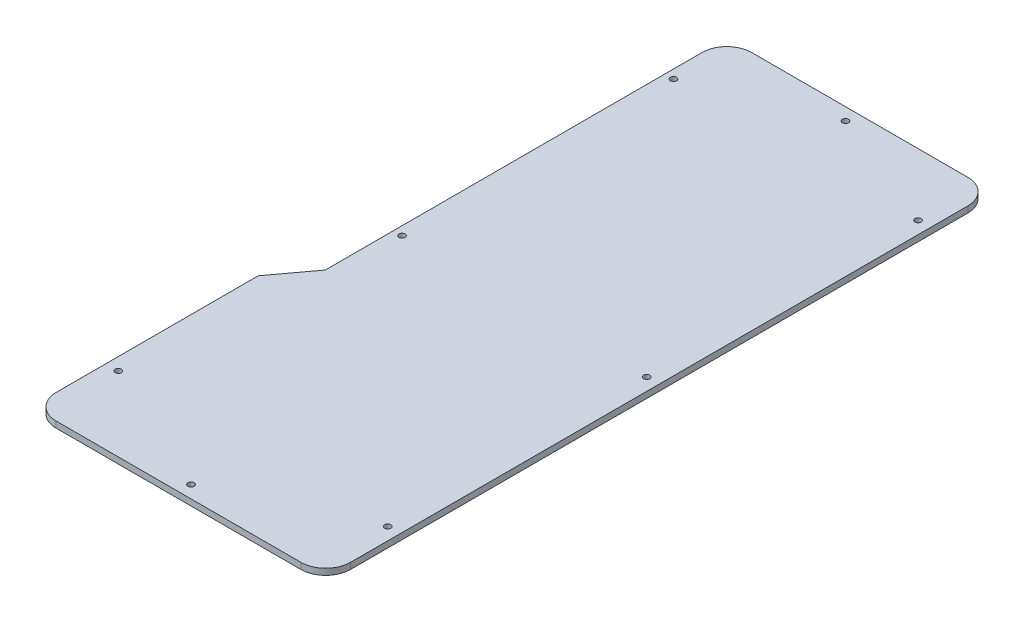
ISO-10303-21;
HEADER;
FILE_DESCRIPTION(('STEP AP214'),'2;1');
FILE_NAME('part.step','',(''),(''),'','','');
FILE_SCHEMA(('AUTOMOTIVE_DESIGN { 1 0 10303 214 1 1 1 1 }'));
ENDSEC;
DATA;
#1=APPLICATION_CONTEXT('core data for automotive mechanical design processes');
#2=APPLICATION_PROTOCOL_DEFINITION('international standard','automotive_design',2000,#1);
#3=PRODUCT_CONTEXT('',#1,'mechanical');
#4=PRODUCT('Part','Part','',(#3));
#5=PRODUCT_RELATED_PRODUCT_CATEGORY('part','',(#4));
#6=PRODUCT_DEFINITION_FORMATION('','',#4);
#7=PRODUCT_DEFINITION_CONTEXT('part definition',#1,'design');
#8=PRODUCT_DEFINITION('design','',#6,#7);
#9=PRODUCT_DEFINITION_SHAPE('','',#8);
#10=(LENGTH_UNIT() NAMED_UNIT(*) SI_UNIT(.MILLI.,.METRE.));
#11=(NAMED_UNIT(*) PLANE_ANGLE_UNIT() SI_UNIT($,.RADIAN.));
#12=(NAMED_UNIT(*) SI_UNIT($,.STERADIAN.) SOLID_ANGLE_UNIT());
#13=UNCERTAINTY_MEASURE_WITH_UNIT(LENGTH_MEASURE(1.E-05),#10,'distance_accuracy_value','');
#14=(GEOMETRIC_REPRESENTATION_CONTEXT(3) GLOBAL_UNCERTAINTY_ASSIGNED_CONTEXT((#13)) GLOBAL_UNIT_ASSIGNED_CONTEXT((#10,
#11,#12)) REPRESENTATION_CONTEXT('',''));
#15=CARTESIAN_POINT('',(0.,0.,0.));
#16=DIRECTION('',(0.,0.,1.));
#17=DIRECTION('',(1.,0.,0.));
#18=AXIS2_PLACEMENT_3D('',#15,#16,#17);
#19=CARTESIAN_POINT('',(51.,393.5,598.5));
#20=DIRECTION('',(0.,-1.,0.));
#21=DIRECTION('',(0.,0.,-1.));
#22=AXIS2_PLACEMENT_3D('',#19,#20,#21);
#23=PLANE('',#22);
#24=CARTESIAN_POINT('',(258.,393.5,350.));
#25=DIRECTION('',(0.,1.,0.));
#26=DIRECTION('',(0.,0.,-1.));
#27=AXIS2_PLACEMENT_3D('',#24,#25,#26);
#28=CIRCLE('',#27,2.50000000000002);
#29=CARTESIAN_POINT('',(258.,393.5,347.5));
#30=VERTEX_POINT('',#29);
#31=EDGE_CURVE('E294',#30,#30,#28,.T.);
#32=ORIENTED_EDGE('',*,*,#31,.T.);
#33=EDGE_LOOP('',(#32));
#34=FACE_BOUND('',#33,.T.);
#35=CARTESIAN_POINT('',(258.,393.5,558.5));
#36=DIRECTION('',(0.,1.,0.));
#37=DIRECTION('',(0.,0.,-1.));
#38=AXIS2_PLACEMENT_3D('',#35,#36,#37);
#39=CIRCLE('',#38,2.50000000000008);
#40=CARTESIAN_POINT('',(258.,393.5,556.));
#41=VERTEX_POINT('',#40);
#42=EDGE_CURVE('E302',#41,#41,#39,.T.);
#43=ORIENTED_EDGE('',*,*,#42,.T.);
#44=EDGE_LOOP('',(#43));
#45=FACE_BOUND('',#44,.T.);
#46=CARTESIAN_POINT('',(61.0000000000001,393.5,350.));
#47=DIRECTION('',(0.,1.,0.));
#48=DIRECTION('',(0.,0.,-1.));
#49=AXIS2_PLACEMENT_3D('',#46,#47,#48);
#50=CIRCLE('',#49,2.5);
#51=CARTESIAN_POINT('',(61.0000000000001,393.5,347.5));
#52=VERTEX_POINT('',#51);
#53=EDGE_CURVE('E310',#52,#52,#50,.T.);
#54=ORIENTED_EDGE('',*,*,#53,.T.);
#55=EDGE_LOOP('',(#54));
#56=FACE_BOUND('',#55,.T.);
#57=CARTESIAN_POINT('',(159.5,393.5,91.4999999999998));
#58=DIRECTION('',(0.,1.,0.));
#59=DIRECTION('',(0.,0.,-1.));
#60=AXIS2_PLACEMENT_3D('',#57,#58,#59);
#61=CIRCLE('',#60,2.5);
#62=CARTESIAN_POINT('',(159.5,393.5,88.9999999999998));
#63=VERTEX_POINT('',#62);
#64=EDGE_CURVE('E219',#63,#63,#61,.T.);
#65=ORIENTED_EDGE('',*,*,#64,.T.);
#66=EDGE_LOOP('',(#65));
#67=FACE_BOUND('',#66,.T.);
#68=DIRECTION('',(-0.595227550625737,0.,0.803557193344746));
#69=VECTOR('',#68,1.);
#70=CARTESIAN_POINT('',(51.0000000000001,393.5,408.899404767177));
#71=LINE('',#70,#69);
#72=CARTESIAN_POINT('',(54.0000000000001,393.5,404.849404767177));
#73=VERTEX_POINT('',#72);
#74=CARTESIAN_POINT('',(31.,393.5,435.899404767177));
#75=VERTEX_POINT('',#74);
#76=EDGE_CURVE('E153',#73,#75,#71,.T.);
#77=ORIENTED_EDGE('',*,*,#76,.F.);
#78=DIRECTION('',(0.,0.,1.));
#79=VECTOR('',#78,1.);
#80=CARTESIAN_POINT('',(54.0000000000001,393.5,101.5));
#81=LINE('',#80,#79);
#82=CARTESIAN_POINT('',(54.0000000000001,393.5,101.5));
#83=VERTEX_POINT('',#82);
#84=EDGE_CURVE('E211',#83,#73,#81,.T.);
#85=ORIENTED_EDGE('',*,*,#84,.F.);
#86=CARTESIAN_POINT('',(74.0000000000001,393.5,101.5));
#87=DIRECTION('',(0.,1.,0.));
#88=DIRECTION('',(0.,0.,-1.));
#89=AXIS2_PLACEMENT_3D('',#86,#87,#88);
#90=CIRCLE('',#89,20.);
#91=CARTESIAN_POINT('',(74.0000000000002,393.5,81.4999999999998));
#92=VERTEX_POINT('',#91);
#93=EDGE_CURVE('E175',#92,#83,#90,.T.);
#94=ORIENTED_EDGE('',*,*,#93,.F.);
#95=DIRECTION('',(-1.,0.,0.));
#96=VECTOR('',#95,1.);
#97=CARTESIAN_POINT('',(248.,393.5,81.4999999999998));
#98=LINE('',#97,#96);
#99=CARTESIAN_POINT('',(248.,393.5,81.4999999999998));
#100=VERTEX_POINT('',#99);
#101=EDGE_CURVE('E172',#100,#92,#98,.T.);
#102=ORIENTED_EDGE('',*,*,#101,.F.);
#103=CARTESIAN_POINT('',(248.,393.5,101.5));
#104=DIRECTION('',(0.,1.,0.));
#105=DIRECTION('',(0.,0.,-1.));
#106=AXIS2_PLACEMENT_3D('',#103,#104,#105);
#107=CIRCLE('',#106,20.);
#108=CARTESIAN_POINT('',(268.,393.5,101.5));
#109=VERTEX_POINT('',#108);
#110=EDGE_CURVE('E169',#109,#100,#107,.T.);
#111=ORIENTED_EDGE('',*,*,#110,.F.);
#112=DIRECTION('',(0.,0.,-1.));
#113=VECTOR('',#112,1.);
#114=CARTESIAN_POINT('',(268.,393.5,598.5));
#115=LINE('',#114,#113);
#116=CARTESIAN_POINT('',(268.,393.5,598.5));
#117=VERTEX_POINT('',#116);
#118=EDGE_CURVE('E166',#117,#109,#115,.T.);
#119=ORIENTED_EDGE('',*,*,#118,.F.);
#120=CARTESIAN_POINT('',(248.,393.5,598.5));
#121=DIRECTION('',(0.,1.,0.));
#122=DIRECTION('',(0.,0.,-1.));
#123=AXIS2_PLACEMENT_3D('',#120,#121,#122);
#124=CIRCLE('',#123,20.);
#125=CARTESIAN_POINT('',(248.,393.5,618.5));
#126=VERTEX_POINT('',#125);
#127=EDGE_CURVE('E160',#126,#117,#124,.T.);
#128=ORIENTED_EDGE('',*,*,#127,.F.);
#129=DIRECTION('',(1.,0.,0.));
#130=VECTOR('',#129,1.);
#131=CARTESIAN_POINT('',(51.0000000000002,393.5,618.5));
#132=LINE('',#131,#130);
#133=CARTESIAN_POINT('',(51.0000000000002,393.5,618.5));
#134=VERTEX_POINT('',#133);
#135=EDGE_CURVE('E158',#134,#126,#132,.T.);
#136=ORIENTED_EDGE('',*,*,#135,.F.);
#137=CARTESIAN_POINT('',(51.,393.5,598.5));
#138=DIRECTION('',(0.,1.,0.));
#139=DIRECTION('',(0.,0.,-1.));
#140=AXIS2_PLACEMENT_3D('',#137,#138,#139);
#141=CIRCLE('',#140,20.);
#142=CARTESIAN_POINT('',(31.,393.5,598.5));
#143=VERTEX_POINT('',#142);
#144=EDGE_CURVE('E139',#143,#134,#141,.T.);
#145=ORIENTED_EDGE('',*,*,#144,.F.);
#146=DIRECTION('',(0.,0.,1.));
#147=VECTOR('',#146,1.);
#148=CARTESIAN_POINT('',(31.,393.5,421.899404767177));
#149=LINE('',#148,#147);
#150=EDGE_CURVE('E149',#75,#143,#149,.T.);
#151=ORIENTED_EDGE('',*,*,#150,.F.);
#152=EDGE_LOOP('',(#77,#85,#94,#102,#111,#119,#128,#136,#145,#151));
#153=FACE_BOUND('',#152,.T.);
#154=CARTESIAN_POINT('',(61.0000000000001,393.5,131.5));
#155=DIRECTION('',(0.,1.,0.));
#156=DIRECTION('',(0.,0.,-1.));
#157=AXIS2_PLACEMENT_3D('',#154,#155,#156);
#158=CIRCLE('',#157,2.5);
#159=CARTESIAN_POINT('',(61.0000000000001,393.5,129.));
#160=VERTEX_POINT('',#159);
#161=EDGE_CURVE('E314',#160,#160,#158,.T.);
#162=ORIENTED_EDGE('',*,*,#161,.T.);
#163=EDGE_LOOP('',(#162));
#164=FACE_BOUND('',#163,.T.);
#165=CARTESIAN_POINT('',(41.,393.5,558.5));
#166=DIRECTION('',(0.,1.,0.));
#167=DIRECTION('',(0.,0.,-1.));
#168=AXIS2_PLACEMENT_3D('',#165,#166,#167);
#169=CIRCLE('',#168,2.50000000000006);
#170=CARTESIAN_POINT('',(41.,393.5,556.));
#171=VERTEX_POINT('',#170);
#172=EDGE_CURVE('E306',#171,#171,#169,.T.);
#173=ORIENTED_EDGE('',*,*,#172,.T.);
#174=EDGE_LOOP('',(#173));
#175=FACE_BOUND('',#174,.T.);
#176=CARTESIAN_POINT('',(258.,393.5,131.5));
#177=DIRECTION('',(0.,1.,0.));
#178=DIRECTION('',(0.,0.,-1.));
#179=AXIS2_PLACEMENT_3D('',#176,#177,#178);
#180=CIRCLE('',#179,2.50000000000002);
#181=CARTESIAN_POINT('',(258.,393.5,129.));
#182=VERTEX_POINT('',#181);
#183=EDGE_CURVE('E298',#182,#182,#180,.T.);
#184=ORIENTED_EDGE('',*,*,#183,.T.);
#185=EDGE_LOOP('',(#184));
#186=FACE_BOUND('',#185,.T.);
#187=CARTESIAN_POINT('',(149.5,393.5,608.5));
#188=DIRECTION('',(0.,1.,0.));
#189=DIRECTION('',(0.,0.,-1.));
#190=AXIS2_PLACEMENT_3D('',#187,#188,#189);
#191=CIRCLE('',#190,2.49999999999994);
#192=CARTESIAN_POINT('',(149.5,393.5,606.));
#193=VERTEX_POINT('',#192);
#194=EDGE_CURVE('E289',#193,#193,#191,.T.);
#195=ORIENTED_EDGE('',*,*,#194,.T.);
#196=EDGE_LOOP('',(#195));
#197=FACE_BOUND('',#196,.T.);
#198=ADVANCED_FACE('F46',(#34,#45,#56,#67,#153,#164,#175,#186,#197),#23,.T.);
#199=CARTESIAN_POINT('',(51.,398.5,598.5));
#200=DIRECTION('',(0.,-1.,0.));
#201=DIRECTION('',(0.,0.,-1.));
#202=AXIS2_PLACEMENT_3D('',#199,#200,#201);
#203=PLANE('',#202);
#204=DIRECTION('',(-0.595227550625737,0.,0.803557193344746));
#205=VECTOR('',#204,1.);
#206=CARTESIAN_POINT('',(51.0000000000001,398.5,408.899404767177));
#207=LINE('',#206,#205);
#208=CARTESIAN_POINT('',(54.0000000000001,398.5,404.849404767177));
#209=VERTEX_POINT('',#208);
#210=CARTESIAN_POINT('',(31.,398.5,435.899404767177));
#211=VERTEX_POINT('',#210);
#212=EDGE_CURVE('E178',#209,#211,#207,.T.);
#213=ORIENTED_EDGE('',*,*,#212,.T.);
#214=DIRECTION('',(0.,0.,1.));
#215=VECTOR('',#214,1.);
#216=CARTESIAN_POINT('',(31.,398.5,421.899404767177));
#217=LINE('',#216,#215);
#218=CARTESIAN_POINT('',(31.,398.5,598.5));
#219=VERTEX_POINT('',#218);
#220=EDGE_CURVE('E176',#211,#219,#217,.T.);
#221=ORIENTED_EDGE('',*,*,#220,.T.);
#222=CARTESIAN_POINT('',(51.,398.5,598.5));
#223=DIRECTION('',(0.,1.,0.));
#224=DIRECTION('',(0.,0.,-1.));
#225=AXIS2_PLACEMENT_3D('',#222,#223,#224);
#226=CIRCLE('',#225,20.);
#227=CARTESIAN_POINT('',(51.0000000000002,398.5,618.5));
#228=VERTEX_POINT('',#227);
#229=EDGE_CURVE('E142',#219,#228,#226,.T.);
#230=ORIENTED_EDGE('',*,*,#229,.T.);
#231=DIRECTION('',(1.,0.,0.));
#232=VECTOR('',#231,1.);
#233=CARTESIAN_POINT('',(51.0000000000002,398.5,618.5));
#234=LINE('',#233,#232);
#235=CARTESIAN_POINT('',(248.,398.5,618.5));
#236=VERTEX_POINT('',#235);
#237=EDGE_CURVE('E180',#228,#236,#234,.T.);
#238=ORIENTED_EDGE('',*,*,#237,.T.);
#239=CARTESIAN_POINT('',(248.,398.5,598.5));
#240=DIRECTION('',(0.,1.,0.));
#241=DIRECTION('',(0.,0.,-1.));
#242=AXIS2_PLACEMENT_3D('',#239,#240,#241);
#243=CIRCLE('',#242,20.);
#244=CARTESIAN_POINT('',(268.,398.5,598.5));
#245=VERTEX_POINT('',#244);
#246=EDGE_CURVE('E183',#236,#245,#243,.T.);
#247=ORIENTED_EDGE('',*,*,#246,.T.);
#248=DIRECTION('',(0.,0.,-1.));
#249=VECTOR('',#248,1.);
#250=CARTESIAN_POINT('',(268.,398.5,598.5));
#251=LINE('',#250,#249);
#252=CARTESIAN_POINT('',(268.,398.5,101.5));
#253=VERTEX_POINT('',#252);
#254=EDGE_CURVE('E186',#245,#253,#251,.T.);
#255=ORIENTED_EDGE('',*,*,#254,.T.);
#256=CARTESIAN_POINT('',(248.,398.5,101.5));
#257=DIRECTION('',(0.,1.,0.));
#258=DIRECTION('',(0.,0.,-1.));
#259=AXIS2_PLACEMENT_3D('',#256,#257,#258);
#260=CIRCLE('',#259,20.);
#261=CARTESIAN_POINT('',(248.,398.5,81.4999999999998));
#262=VERTEX_POINT('',#261);
#263=EDGE_CURVE('E189',#253,#262,#260,.T.);
#264=ORIENTED_EDGE('',*,*,#263,.T.);
#265=DIRECTION('',(-1.,0.,0.));
#266=VECTOR('',#265,1.);
#267=CARTESIAN_POINT('',(248.,398.5,81.4999999999998));
#268=LINE('',#267,#266);
#269=CARTESIAN_POINT('',(74.0000000000002,398.5,81.4999999999998));
#270=VERTEX_POINT('',#269);
#271=EDGE_CURVE('E192',#262,#270,#268,.T.);
#272=ORIENTED_EDGE('',*,*,#271,.T.);
#273=CARTESIAN_POINT('',(74.0000000000001,398.5,101.5));
#274=DIRECTION('',(0.,1.,0.));
#275=DIRECTION('',(0.,0.,-1.));
#276=AXIS2_PLACEMENT_3D('',#273,#274,#275);
#277=CIRCLE('',#276,20.);
#278=CARTESIAN_POINT('',(54.0000000000001,398.5,101.5));
#279=VERTEX_POINT('',#278);
#280=EDGE_CURVE('E195',#270,#279,#277,.T.);
#281=ORIENTED_EDGE('',*,*,#280,.T.);
#282=DIRECTION('',(0.,0.,1.));
#283=VECTOR('',#282,1.);
#284=CARTESIAN_POINT('',(54.0000000000001,398.5,101.5));
#285=LINE('',#284,#283);
#286=EDGE_CURVE('E208',#279,#209,#285,.T.);
#287=ORIENTED_EDGE('',*,*,#286,.T.);
#288=EDGE_LOOP('',(#213,#221,#230,#238,#247,#255,#264,#272,#281,#287));
#289=FACE_BOUND('',#288,.T.);
#290=CARTESIAN_POINT('',(159.5,398.5,91.4999999999998));
#291=DIRECTION('',(0.,1.,0.));
#292=DIRECTION('',(0.,0.,-1.));
#293=AXIS2_PLACEMENT_3D('',#290,#291,#292);
#294=CIRCLE('',#293,2.5);
#295=CARTESIAN_POINT('',(159.5,398.5,88.9999999999998));
#296=VERTEX_POINT('',#295);
#297=EDGE_CURVE('E260',#296,#296,#294,.T.);
#298=ORIENTED_EDGE('',*,*,#297,.F.);
#299=EDGE_LOOP('',(#298));
#300=FACE_BOUND('',#299,.T.);
#301=CARTESIAN_POINT('',(61.0000000000001,398.5,131.5));
#302=DIRECTION('',(0.,1.,0.));
#303=DIRECTION('',(0.,0.,-1.));
#304=AXIS2_PLACEMENT_3D('',#301,#302,#303);
#305=CIRCLE('',#304,2.5);
#306=CARTESIAN_POINT('',(61.0000000000001,398.5,129.));
#307=VERTEX_POINT('',#306);
#308=EDGE_CURVE('E264',#307,#307,#305,.T.);
#309=ORIENTED_EDGE('',*,*,#308,.F.);
#310=EDGE_LOOP('',(#309));
#311=FACE_BOUND('',#310,.T.);
#312=CARTESIAN_POINT('',(61.0000000000001,398.5,350.));
#313=DIRECTION('',(0.,1.,0.));
#314=DIRECTION('',(0.,0.,-1.));
#315=AXIS2_PLACEMENT_3D('',#312,#313,#314);
#316=CIRCLE('',#315,2.5);
#317=CARTESIAN_POINT('',(61.0000000000001,398.5,347.5));
#318=VERTEX_POINT('',#317);
#319=EDGE_CURVE('E268',#318,#318,#316,.T.);
#320=ORIENTED_EDGE('',*,*,#319,.F.);
#321=EDGE_LOOP('',(#320));
#322=FACE_BOUND('',#321,.T.);
#323=CARTESIAN_POINT('',(41.,398.5,558.5));
#324=DIRECTION('',(0.,1.,0.));
#325=DIRECTION('',(0.,0.,-1.));
#326=AXIS2_PLACEMENT_3D('',#323,#324,#325);
#327=CIRCLE('',#326,2.50000000000006);
#328=CARTESIAN_POINT('',(41.,398.5,556.));
#329=VERTEX_POINT('',#328);
#330=EDGE_CURVE('E272',#329,#329,#327,.T.);
#331=ORIENTED_EDGE('',*,*,#330,.F.);
#332=EDGE_LOOP('',(#331));
#333=FACE_BOUND('',#332,.T.);
#334=CARTESIAN_POINT('',(258.,398.5,558.5));
#335=DIRECTION('',(0.,1.,0.));
#336=DIRECTION('',(0.,0.,-1.));
#337=AXIS2_PLACEMENT_3D('',#334,#335,#336);
#338=CIRCLE('',#337,2.50000000000008);
#339=CARTESIAN_POINT('',(258.,398.5,556.));
#340=VERTEX_POINT('',#339);
#341=EDGE_CURVE('E276',#340,#340,#338,.T.);
#342=ORIENTED_EDGE('',*,*,#341,.F.);
#343=EDGE_LOOP('',(#342));
#344=FACE_BOUND('',#343,.T.);
#345=CARTESIAN_POINT('',(258.,398.5,131.5));
#346=DIRECTION('',(0.,1.,0.));
#347=DIRECTION('',(0.,0.,-1.));
#348=AXIS2_PLACEMENT_3D('',#345,#346,#347);
#349=CIRCLE('',#348,2.50000000000002);
#350=CARTESIAN_POINT('',(258.,398.5,129.));
#351=VERTEX_POINT('',#350);
#352=EDGE_CURVE('E280',#351,#351,#349,.T.);
#353=ORIENTED_EDGE('',*,*,#352,.F.);
#354=EDGE_LOOP('',(#353));
#355=FACE_BOUND('',#354,.T.);
#356=CARTESIAN_POINT('',(258.,398.5,350.));
#357=DIRECTION('',(0.,1.,0.));
#358=DIRECTION('',(0.,0.,-1.));
#359=AXIS2_PLACEMENT_3D('',#356,#357,#358);
#360=CIRCLE('',#359,2.50000000000002);
#361=CARTESIAN_POINT('',(258.,398.5,347.5));
#362=VERTEX_POINT('',#361);
#363=EDGE_CURVE('E284',#362,#362,#360,.T.);
#364=ORIENTED_EDGE('',*,*,#363,.F.);
#365=EDGE_LOOP('',(#364));
#366=FACE_BOUND('',#365,.T.);
#367=CARTESIAN_POINT('',(149.5,398.5,608.5));
#368=DIRECTION('',(0.,1.,0.));
#369=DIRECTION('',(0.,0.,-1.));
#370=AXIS2_PLACEMENT_3D('',#367,#368,#369);
#371=CIRCLE('',#370,2.49999999999994);
#372=CARTESIAN_POINT('',(149.5,398.5,606.));
#373=VERTEX_POINT('',#372);
#374=EDGE_CURVE('E287',#373,#373,#371,.T.);
#375=ORIENTED_EDGE('',*,*,#374,.F.);
#376=EDGE_LOOP('',(#375));
#377=FACE_BOUND('',#376,.T.);
#378=ADVANCED_FACE('F247',(#289,#300,#311,#322,#333,#344,#355,#366,#377),#203,.F.);
#379=CARTESIAN_POINT('',(51.0000000000001,393.5,408.899404767177));
#380=DIRECTION('',(0.803557193344746,0.,0.595227550625737));
#381=DIRECTION('',(-0.595227550625738,0.,0.803557193344746));
#382=AXIS2_PLACEMENT_3D('',#379,#380,#381);
#383=PLANE('',#382);
#384=ORIENTED_EDGE('',*,*,#212,.F.);
#385=DIRECTION('',(0.,1.,0.));
#386=VECTOR('',#385,1.);
#387=CARTESIAN_POINT('',(54.0000000000001,393.5,404.849404767177));
#388=LINE('',#387,#386);
#389=EDGE_CURVE('E50',#73,#209,#388,.T.);
#390=ORIENTED_EDGE('',*,*,#389,.F.);
#391=ORIENTED_EDGE('',*,*,#76,.T.);
#392=DIRECTION('',(0.,1.,0.));
#393=VECTOR('',#392,1.);
#394=CARTESIAN_POINT('',(31.,393.5,435.899404767177));
#395=LINE('',#394,#393);
#396=EDGE_CURVE('E12',#75,#211,#395,.T.);
#397=ORIENTED_EDGE('',*,*,#396,.T.);
#398=EDGE_LOOP('',(#384,#390,#391,#397));
#399=FACE_BOUND('',#398,.T.);
#400=ADVANCED_FACE('F48',(#399),#383,.F.);
#401=CARTESIAN_POINT('',(31.,393.5,421.899404767177));
#402=DIRECTION('',(1.,0.,0.));
#403=DIRECTION('',(0.,0.,1.));
#404=AXIS2_PLACEMENT_3D('',#401,#402,#403);
#405=PLANE('',#404);
#406=ORIENTED_EDGE('',*,*,#220,.F.);
#407=ORIENTED_EDGE('',*,*,#396,.F.);
#408=ORIENTED_EDGE('',*,*,#150,.T.);
#409=DIRECTION('',(0.,1.,0.));
#410=VECTOR('',#409,1.);
#411=CARTESIAN_POINT('',(31.,393.5,598.5));
#412=LINE('',#411,#410);
#413=EDGE_CURVE('E56',#143,#219,#412,.T.);
#414=ORIENTED_EDGE('',*,*,#413,.T.);
#415=EDGE_LOOP('',(#406,#407,#408,#414));
#416=FACE_BOUND('',#415,.T.);
#417=ADVANCED_FACE('F150',(#416),#405,.F.);
#418=CARTESIAN_POINT('',(51.,393.5,598.5));
#419=DIRECTION('',(0.,1.,0.));
#420=DIRECTION('',(0.,0.,1.));
#421=AXIS2_PLACEMENT_3D('',#418,#419,#420);
#422=CYLINDRICAL_SURFACE('',#421,20.);
#423=ORIENTED_EDGE('',*,*,#229,.F.);
#424=ORIENTED_EDGE('',*,*,#413,.F.);
#425=ORIENTED_EDGE('',*,*,#144,.T.);
#426=DIRECTION('',(0.,1.,0.));
#427=VECTOR('',#426,1.);
#428=CARTESIAN_POINT('',(51.0000000000002,393.5,618.5));
#429=LINE('',#428,#427);
#430=EDGE_CURVE('E146',#134,#228,#429,.T.);
#431=ORIENTED_EDGE('',*,*,#430,.T.);
#432=EDGE_LOOP('',(#423,#424,#425,#431));
#433=FACE_BOUND('',#432,.T.);
#434=ADVANCED_FACE('F137',(#433),#422,.T.);
#435=CARTESIAN_POINT('',(51.0000000000002,393.5,618.5));
#436=DIRECTION('',(0.,0.,-1.));
#437=DIRECTION('',(1.,0.,0.));
#438=AXIS2_PLACEMENT_3D('',#435,#436,#437);
#439=PLANE('',#438);
#440=ORIENTED_EDGE('',*,*,#237,.F.);
#441=ORIENTED_EDGE('',*,*,#430,.F.);
#442=ORIENTED_EDGE('',*,*,#135,.T.);
#443=DIRECTION('',(0.,1.,0.));
#444=VECTOR('',#443,1.);
#445=CARTESIAN_POINT('',(248.,393.5,618.5));
#446=LINE('',#445,#444);
#447=EDGE_CURVE('E203',#126,#236,#446,.T.);
#448=ORIENTED_EDGE('',*,*,#447,.T.);
#449=EDGE_LOOP('',(#440,#441,#442,#448));
#450=FACE_BOUND('',#449,.T.);
#451=ADVANCED_FACE('F245',(#450),#439,.F.);
#452=CARTESIAN_POINT('',(248.,393.5,598.5));
#453=DIRECTION('',(0.,1.,0.));
#454=DIRECTION('',(0.,0.,1.));
#455=AXIS2_PLACEMENT_3D('',#452,#453,#454);
#456=CYLINDRICAL_SURFACE('',#455,20.);
#457=ORIENTED_EDGE('',*,*,#246,.F.);
#458=ORIENTED_EDGE('',*,*,#447,.F.);
#459=ORIENTED_EDGE('',*,*,#127,.T.);
#460=DIRECTION('',(0.,1.,0.));
#461=VECTOR('',#460,1.);
#462=CARTESIAN_POINT('',(268.,393.5,598.5));
#463=LINE('',#462,#461);
#464=EDGE_CURVE('E201',#117,#245,#463,.T.);
#465=ORIENTED_EDGE('',*,*,#464,.T.);
#466=EDGE_LOOP('',(#457,#458,#459,#465));
#467=FACE_BOUND('',#466,.T.);
#468=ADVANCED_FACE('F242',(#467),#456,.T.);
#469=CARTESIAN_POINT('',(268.,393.5,598.5));
#470=DIRECTION('',(-1.,0.,0.));
#471=DIRECTION('',(0.,0.,-1.));
#472=AXIS2_PLACEMENT_3D('',#469,#470,#471);
#473=PLANE('',#472);
#474=ORIENTED_EDGE('',*,*,#254,.F.);
#475=ORIENTED_EDGE('',*,*,#464,.F.);
#476=ORIENTED_EDGE('',*,*,#118,.T.);
#477=DIRECTION('',(0.,1.,0.));
#478=VECTOR('',#477,1.);
#479=CARTESIAN_POINT('',(268.,393.5,101.5));
#480=LINE('',#479,#478);
#481=EDGE_CURVE('E198',#109,#253,#480,.T.);
#482=ORIENTED_EDGE('',*,*,#481,.T.);
#483=EDGE_LOOP('',(#474,#475,#476,#482));
#484=FACE_BOUND('',#483,.T.);
#485=ADVANCED_FACE('F239',(#484),#473,.F.);
#486=CARTESIAN_POINT('',(248.,393.5,101.5));
#487=DIRECTION('',(0.,1.,0.));
#488=DIRECTION('',(0.,0.,1.));
#489=AXIS2_PLACEMENT_3D('',#486,#487,#488);
#490=CYLINDRICAL_SURFACE('',#489,20.);
#491=ORIENTED_EDGE('',*,*,#263,.F.);
#492=ORIENTED_EDGE('',*,*,#481,.F.);
#493=ORIENTED_EDGE('',*,*,#110,.T.);
#494=DIRECTION('',(0.,1.,0.));
#495=VECTOR('',#494,1.);
#496=CARTESIAN_POINT('',(248.,393.5,81.4999999999998));
#497=LINE('',#496,#495);
#498=EDGE_CURVE('E196',#100,#262,#497,.T.);
#499=ORIENTED_EDGE('',*,*,#498,.T.);
#500=EDGE_LOOP('',(#491,#492,#493,#499));
#501=FACE_BOUND('',#500,.T.);
#502=ADVANCED_FACE('F236',(#501),#490,.T.);
#503=CARTESIAN_POINT('',(248.,393.5,81.4999999999998));
#504=DIRECTION('',(0.,0.,1.));
#505=DIRECTION('',(-1.,0.,0.));
#506=AXIS2_PLACEMENT_3D('',#503,#504,#505);
#507=PLANE('',#506);
#508=ORIENTED_EDGE('',*,*,#271,.F.);
#509=ORIENTED_EDGE('',*,*,#498,.F.);
#510=ORIENTED_EDGE('',*,*,#101,.T.);
#511=DIRECTION('',(0.,1.,0.));
#512=VECTOR('',#511,1.);
#513=CARTESIAN_POINT('',(74.0000000000002,393.5,81.4999999999998));
#514=LINE('',#513,#512);
#515=EDGE_CURVE('E199',#92,#270,#514,.T.);
#516=ORIENTED_EDGE('',*,*,#515,.T.);
#517=EDGE_LOOP('',(#508,#509,#510,#516));
#518=FACE_BOUND('',#517,.T.);
#519=ADVANCED_FACE('F231',(#518),#507,.F.);
#520=CARTESIAN_POINT('',(74.0000000000001,393.5,101.5));
#521=DIRECTION('',(0.,1.,0.));
#522=DIRECTION('',(0.,0.,1.));
#523=AXIS2_PLACEMENT_3D('',#520,#521,#522);
#524=CYLINDRICAL_SURFACE('',#523,20.);
#525=ORIENTED_EDGE('',*,*,#280,.F.);
#526=ORIENTED_EDGE('',*,*,#515,.F.);
#527=ORIENTED_EDGE('',*,*,#93,.T.);
#528=DIRECTION('',(0.,1.,0.));
#529=VECTOR('',#528,1.);
#530=CARTESIAN_POINT('',(54.0000000000001,393.5,101.5));
#531=LINE('',#530,#529);
#532=EDGE_CURVE('E206',#83,#279,#531,.T.);
#533=ORIENTED_EDGE('',*,*,#532,.T.);
#534=EDGE_LOOP('',(#525,#526,#527,#533));
#535=FACE_BOUND('',#534,.T.);
#536=ADVANCED_FACE('F228',(#535),#524,.T.);
#537=CARTESIAN_POINT('',(54.0000000000001,393.5,101.5));
#538=DIRECTION('',(1.,0.,0.));
#539=DIRECTION('',(0.,0.,1.));
#540=AXIS2_PLACEMENT_3D('',#537,#538,#539);
#541=PLANE('',#540);
#542=ORIENTED_EDGE('',*,*,#286,.F.);
#543=ORIENTED_EDGE('',*,*,#532,.F.);
#544=ORIENTED_EDGE('',*,*,#84,.T.);
#545=ORIENTED_EDGE('',*,*,#389,.T.);
#546=EDGE_LOOP('',(#542,#543,#544,#545));
#547=FACE_BOUND('',#546,.T.);
#548=ADVANCED_FACE('F225',(#547),#541,.F.);
#549=CARTESIAN_POINT('',(159.5,393.5,91.4999999999998));
#550=DIRECTION('',(0.,1.,0.));
#551=DIRECTION('',(0.,0.,1.));
#552=AXIS2_PLACEMENT_3D('',#549,#550,#551);
#553=CYLINDRICAL_SURFACE('',#552,2.5);
#554=ORIENTED_EDGE('',*,*,#64,.F.);
#555=EDGE_LOOP('',(#554));
#556=FACE_BOUND('',#555,.T.);
#557=ORIENTED_EDGE('',*,*,#297,.T.);
#558=EDGE_LOOP('',(#557));
#559=FACE_BOUND('',#558,.T.);
#560=ADVANCED_FACE('F320',(#556,#559),#553,.F.);
#561=CARTESIAN_POINT('',(61.0000000000001,393.5,131.5));
#562=DIRECTION('',(0.,1.,0.));
#563=DIRECTION('',(0.,0.,1.));
#564=AXIS2_PLACEMENT_3D('',#561,#562,#563);
#565=CYLINDRICAL_SURFACE('',#564,2.5);
#566=ORIENTED_EDGE('',*,*,#161,.F.);
#567=EDGE_LOOP('',(#566));
#568=FACE_BOUND('',#567,.T.);
#569=ORIENTED_EDGE('',*,*,#308,.T.);
#570=EDGE_LOOP('',(#569));
#571=FACE_BOUND('',#570,.T.);
#572=ADVANCED_FACE('F322',(#568,#571),#565,.F.);
#573=CARTESIAN_POINT('',(61.0000000000001,393.5,350.));
#574=DIRECTION('',(0.,1.,0.));
#575=DIRECTION('',(0.,0.,1.));
#576=AXIS2_PLACEMENT_3D('',#573,#574,#575);
#577=CYLINDRICAL_SURFACE('',#576,2.5);
#578=ORIENTED_EDGE('',*,*,#53,.F.);
#579=EDGE_LOOP('',(#578));
#580=FACE_BOUND('',#579,.T.);
#581=ORIENTED_EDGE('',*,*,#319,.T.);
#582=EDGE_LOOP('',(#581));
#583=FACE_BOUND('',#582,.T.);
#584=ADVANCED_FACE('F329',(#580,#583),#577,.F.);
#585=CARTESIAN_POINT('',(41.,393.5,558.5));
#586=DIRECTION('',(0.,1.,0.));
#587=DIRECTION('',(0.,0.,1.));
#588=AXIS2_PLACEMENT_3D('',#585,#586,#587);
#589=CYLINDRICAL_SURFACE('',#588,2.50000000000006);
#590=ORIENTED_EDGE('',*,*,#172,.F.);
#591=EDGE_LOOP('',(#590));
#592=FACE_BOUND('',#591,.T.);
#593=ORIENTED_EDGE('',*,*,#330,.T.);
#594=EDGE_LOOP('',(#593));
#595=FACE_BOUND('',#594,.T.);
#596=ADVANCED_FACE('F443',(#592,#595),#589,.F.);
#597=CARTESIAN_POINT('',(258.,393.5,558.5));
#598=DIRECTION('',(0.,1.,0.));
#599=DIRECTION('',(0.,0.,1.));
#600=AXIS2_PLACEMENT_3D('',#597,#598,#599);
#601=CYLINDRICAL_SURFACE('',#600,2.50000000000008);
#602=ORIENTED_EDGE('',*,*,#42,.F.);
#603=EDGE_LOOP('',(#602));
#604=FACE_BOUND('',#603,.T.);
#605=ORIENTED_EDGE('',*,*,#341,.T.);
#606=EDGE_LOOP('',(#605));
#607=FACE_BOUND('',#606,.T.);
#608=ADVANCED_FACE('F454',(#604,#607),#601,.F.);
#609=CARTESIAN_POINT('',(258.,393.5,131.5));
#610=DIRECTION('',(0.,1.,0.));
#611=DIRECTION('',(0.,0.,1.));
#612=AXIS2_PLACEMENT_3D('',#609,#610,#611);
#613=CYLINDRICAL_SURFACE('',#612,2.50000000000002);
#614=ORIENTED_EDGE('',*,*,#183,.F.);
#615=EDGE_LOOP('',(#614));
#616=FACE_BOUND('',#615,.T.);
#617=ORIENTED_EDGE('',*,*,#352,.T.);
#618=EDGE_LOOP('',(#617));
#619=FACE_BOUND('',#618,.T.);
#620=ADVANCED_FACE('F464',(#616,#619),#613,.F.);
#621=CARTESIAN_POINT('',(258.,393.5,350.));
#622=DIRECTION('',(0.,1.,0.));
#623=DIRECTION('',(0.,0.,1.));
#624=AXIS2_PLACEMENT_3D('',#621,#622,#623);
#625=CYLINDRICAL_SURFACE('',#624,2.50000000000002);
#626=ORIENTED_EDGE('',*,*,#31,.F.);
#627=EDGE_LOOP('',(#626));
#628=FACE_BOUND('',#627,.T.);
#629=ORIENTED_EDGE('',*,*,#363,.T.);
#630=EDGE_LOOP('',(#629));
#631=FACE_BOUND('',#630,.T.);
#632=ADVANCED_FACE('F474',(#628,#631),#625,.F.);
#633=CARTESIAN_POINT('',(149.5,393.5,608.5));
#634=DIRECTION('',(0.,1.,0.));
#635=DIRECTION('',(0.,0.,1.));
#636=AXIS2_PLACEMENT_3D('',#633,#634,#635);
#637=CYLINDRICAL_SURFACE('',#636,2.49999999999994);
#638=ORIENTED_EDGE('',*,*,#194,.F.);
#639=EDGE_LOOP('',(#638));
#640=FACE_BOUND('',#639,.T.);
#641=ORIENTED_EDGE('',*,*,#374,.T.);
#642=EDGE_LOOP('',(#641));
#643=FACE_BOUND('',#642,.T.);
#644=ADVANCED_FACE('F484',(#640,#643),#637,.F.);
#645=CLOSED_SHELL('',(#198,#378,#400,#417,#434,#451,#468,#485,#502,#519,#536,#548,#560,#572,
#584,#596,#608,#620,#632,#644));
#646=MANIFOLD_SOLID_BREP('B2',#645);
#647=ADVANCED_BREP_SHAPE_REPRESENTATION('',(#18,#646),#14);
#648=SHAPE_DEFINITION_REPRESENTATION(#9,#647);
ENDSEC;
END-ISO-10303-21;
